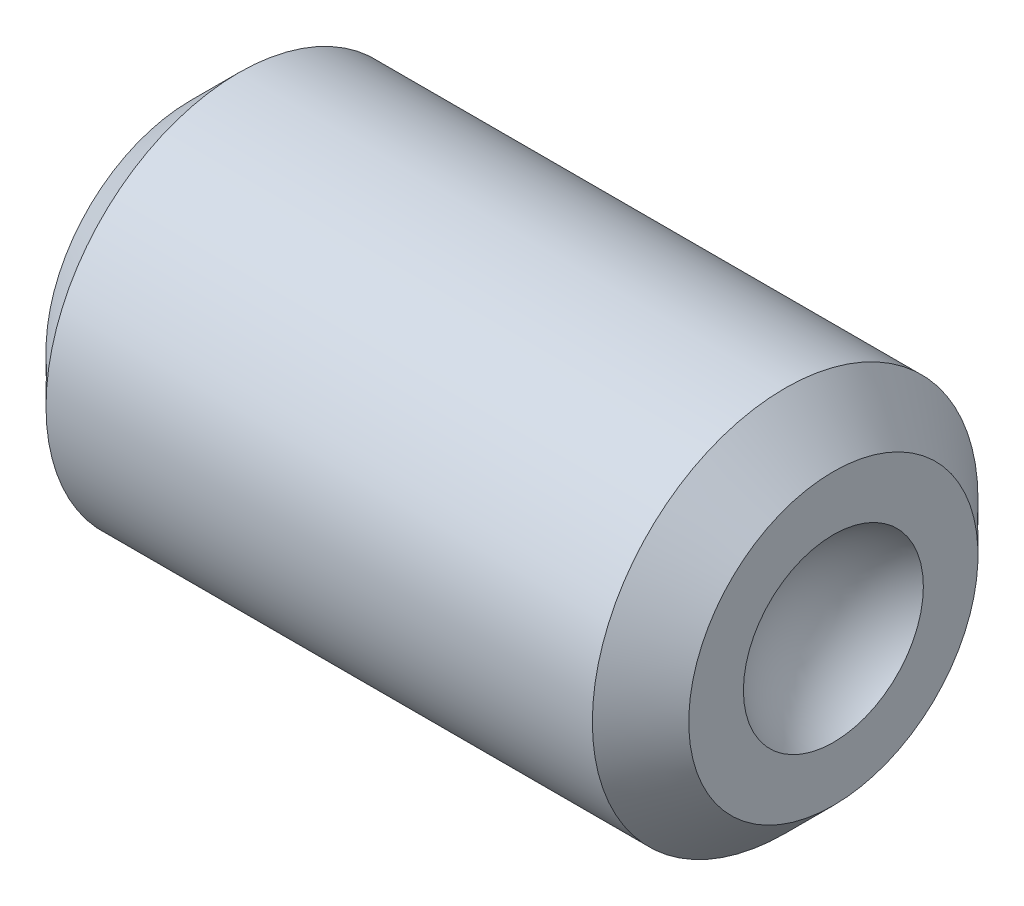
ISO-10303-21;
HEADER;
FILE_DESCRIPTION(('STEP AP214'),'2;1');
FILE_NAME('part.step','',(''),(''),'','','');
FILE_SCHEMA(('AUTOMOTIVE_DESIGN { 1 0 10303 214 1 1 1 1 }'));
ENDSEC;
DATA;
#1=APPLICATION_CONTEXT('core data for automotive mechanical design processes');
#2=APPLICATION_PROTOCOL_DEFINITION('international standard','automotive_design',2000,#1);
#3=PRODUCT_CONTEXT('',#1,'mechanical');
#4=PRODUCT('Part','Part','',(#3));
#5=PRODUCT_RELATED_PRODUCT_CATEGORY('part','',(#4));
#6=PRODUCT_DEFINITION_FORMATION('','',#4);
#7=PRODUCT_DEFINITION_CONTEXT('part definition',#1,'design');
#8=PRODUCT_DEFINITION('design','',#6,#7);
#9=PRODUCT_DEFINITION_SHAPE('','',#8);
#10=(LENGTH_UNIT() NAMED_UNIT(*) SI_UNIT(.MILLI.,.METRE.));
#11=(NAMED_UNIT(*) PLANE_ANGLE_UNIT() SI_UNIT($,.RADIAN.));
#12=(NAMED_UNIT(*) SI_UNIT($,.STERADIAN.) SOLID_ANGLE_UNIT());
#13=UNCERTAINTY_MEASURE_WITH_UNIT(LENGTH_MEASURE(1.E-05),#10,'distance_accuracy_value','');
#14=(GEOMETRIC_REPRESENTATION_CONTEXT(3) GLOBAL_UNCERTAINTY_ASSIGNED_CONTEXT((#13)) GLOBAL_UNIT_ASSIGNED_CONTEXT((#10,
#11,#12)) REPRESENTATION_CONTEXT('',''));
#15=CARTESIAN_POINT('',(0.,0.,0.));
#16=DIRECTION('',(0.,0.,1.));
#17=DIRECTION('',(1.,0.,0.));
#18=AXIS2_PLACEMENT_3D('',#15,#16,#17);
#19=CARTESIAN_POINT('',(0.,0.,0.));
#20=DIRECTION('',(1.,0.,0.));
#21=DIRECTION('',(0.,1.,0.));
#22=AXIS2_PLACEMENT_3D('',#19,#20,#21);
#23=PLANE('',#22);
#24=DIRECTION('',(0.,-0.5,-0.866025403784439));
#25=VECTOR('',#24,1.);
#26=CARTESIAN_POINT('',(0.,0.866025403784439,0.));
#27=LINE('',#26,#25);
#28=CARTESIAN_POINT('',(0.,0.866025403784439,0.));
#29=VERTEX_POINT('',#28);
#30=CARTESIAN_POINT('',(0.,0.43301270189222,-0.75));
#31=VERTEX_POINT('',#30);
#32=EDGE_CURVE('E107',#29,#31,#27,.T.);
#33=ORIENTED_EDGE('',*,*,#32,.F.);
#34=DIRECTION('',(0.,0.5,-0.866025403784439));
#35=VECTOR('',#34,1.);
#36=CARTESIAN_POINT('',(0.,0.433012701892219,0.75));
#37=LINE('',#36,#35);
#38=CARTESIAN_POINT('',(0.,0.433012701892219,0.75));
#39=VERTEX_POINT('',#38);
#40=EDGE_CURVE('E49',#39,#29,#37,.T.);
#41=ORIENTED_EDGE('',*,*,#40,.F.);
#42=DIRECTION('',(0.,1.,0.));
#43=VECTOR('',#42,1.);
#44=CARTESIAN_POINT('',(0.,-0.43301270189222,0.75));
#45=LINE('',#44,#43);
#46=CARTESIAN_POINT('',(0.,-0.43301270189222,0.75));
#47=VERTEX_POINT('',#46);
#48=EDGE_CURVE('E122',#47,#39,#45,.T.);
#49=ORIENTED_EDGE('',*,*,#48,.F.);
#50=DIRECTION('',(0.,0.5,0.866025403784439));
#51=VECTOR('',#50,1.);
#52=CARTESIAN_POINT('',(0.,-0.866025403784439,0.));
#53=LINE('',#52,#51);
#54=CARTESIAN_POINT('',(0.,-0.866025403784439,0.));
#55=VERTEX_POINT('',#54);
#56=EDGE_CURVE('E116',#55,#47,#53,.T.);
#57=ORIENTED_EDGE('',*,*,#56,.F.);
#58=DIRECTION('',(0.,-0.5,0.866025403784439));
#59=VECTOR('',#58,1.);
#60=CARTESIAN_POINT('',(0.,-0.433012701892219,-0.75));
#61=LINE('',#60,#59);
#62=CARTESIAN_POINT('',(0.,-0.433012701892219,-0.75));
#63=VERTEX_POINT('',#62);
#64=EDGE_CURVE('E114',#63,#55,#61,.T.);
#65=ORIENTED_EDGE('',*,*,#64,.F.);
#66=DIRECTION('',(0.,-1.,0.));
#67=VECTOR('',#66,1.);
#68=CARTESIAN_POINT('',(0.,0.43301270189222,-0.75));
#69=LINE('',#68,#67);
#70=EDGE_CURVE('E100',#31,#63,#69,.T.);
#71=ORIENTED_EDGE('',*,*,#70,.F.);
#72=EDGE_LOOP('',(#33,#41,#49,#57,#65,#71));
#73=FACE_BOUND('',#72,.T.);
#74=CARTESIAN_POINT('',(0.,0.,0.));
#75=DIRECTION('',(-1.,0.,0.));
#76=DIRECTION('',(0.,-1.,0.));
#77=AXIS2_PLACEMENT_3D('',#74,#75,#76);
#78=CIRCLE('',#77,1.125);
#79=CARTESIAN_POINT('',(0.,-1.125,0.));
#80=VERTEX_POINT('',#79);
#81=EDGE_CURVE('E12',#80,#80,#78,.T.);
#82=ORIENTED_EDGE('',*,*,#81,.T.);
#83=EDGE_LOOP('',(#82));
#84=FACE_BOUND('',#83,.T.);
#85=ADVANCED_FACE('F35',(#73,#84),#23,.F.);
#86=CARTESIAN_POINT('',(0.375000000000001,0.,0.));
#87=DIRECTION('',(1.,0.,0.));
#88=DIRECTION('',(0.,1.,0.));
#89=AXIS2_PLACEMENT_3D('',#86,#87,#88);
#90=CONICAL_SURFACE('',#89,1.5,0.785398163397447);
#91=ORIENTED_EDGE('',*,*,#81,.F.);
#92=EDGE_LOOP('',(#91));
#93=FACE_BOUND('',#92,.T.);
#94=CARTESIAN_POINT('',(0.375000000000001,0.,0.));
#95=DIRECTION('',(-1.,0.,0.));
#96=DIRECTION('',(0.,-1.,0.));
#97=AXIS2_PLACEMENT_3D('',#94,#95,#96);
#98=CIRCLE('',#97,1.5);
#99=CARTESIAN_POINT('',(0.375000000000001,-1.5,0.));
#100=VERTEX_POINT('',#99);
#101=EDGE_CURVE('E42',#100,#100,#98,.T.);
#102=ORIENTED_EDGE('',*,*,#101,.T.);
#103=EDGE_LOOP('',(#102));
#104=FACE_BOUND('',#103,.T.);
#105=ADVANCED_FACE('F145',(#93,#104),#90,.T.);
#106=CARTESIAN_POINT('',(0.,0.,0.));
#107=DIRECTION('',(-1.,0.,0.));
#108=DIRECTION('',(0.,-1.,0.));
#109=AXIS2_PLACEMENT_3D('',#106,#107,#108);
#110=CYLINDRICAL_SURFACE('',#109,1.5);
#111=ORIENTED_EDGE('',*,*,#101,.F.);
#112=EDGE_LOOP('',(#111));
#113=FACE_BOUND('',#112,.T.);
#114=CARTESIAN_POINT('',(4.625,0.,0.));
#115=DIRECTION('',(-1.,0.,0.));
#116=DIRECTION('',(0.,-1.,0.));
#117=AXIS2_PLACEMENT_3D('',#114,#115,#116);
#118=CIRCLE('',#117,1.5);
#119=CARTESIAN_POINT('',(4.625,-1.5,0.));
#120=VERTEX_POINT('',#119);
#121=EDGE_CURVE('E140',#120,#120,#118,.T.);
#122=ORIENTED_EDGE('',*,*,#121,.T.);
#123=EDGE_LOOP('',(#122));
#124=FACE_BOUND('',#123,.T.);
#125=ADVANCED_FACE('F147',(#113,#124),#110,.T.);
#126=CARTESIAN_POINT('',(5.,0.,0.));
#127=DIRECTION('',(-1.,0.,0.));
#128=DIRECTION('',(0.,-1.,0.));
#129=AXIS2_PLACEMENT_3D('',#126,#127,#128);
#130=CONICAL_SURFACE('',#129,1.125,0.785398163397449);
#131=ORIENTED_EDGE('',*,*,#121,.F.);
#132=EDGE_LOOP('',(#131));
#133=FACE_BOUND('',#132,.T.);
#134=CARTESIAN_POINT('',(5.,0.,0.));
#135=DIRECTION('',(-1.,0.,0.));
#136=DIRECTION('',(0.,-1.,0.));
#137=AXIS2_PLACEMENT_3D('',#134,#135,#136);
#138=CIRCLE('',#137,1.125);
#139=CARTESIAN_POINT('',(5.,-1.125,0.));
#140=VERTEX_POINT('',#139);
#141=EDGE_CURVE('E137',#140,#140,#138,.T.);
#142=ORIENTED_EDGE('',*,*,#141,.T.);
#143=EDGE_LOOP('',(#142));
#144=FACE_BOUND('',#143,.T.);
#145=ADVANCED_FACE('F150',(#133,#144),#130,.T.);
#146=CARTESIAN_POINT('',(5.,1.125,0.));
#147=DIRECTION('',(-1.,0.,0.));
#148=DIRECTION('',(0.,-1.,0.));
#149=AXIS2_PLACEMENT_3D('',#146,#147,#148);
#150=PLANE('',#149);
#151=ORIENTED_EDGE('',*,*,#141,.F.);
#152=EDGE_LOOP('',(#151));
#153=FACE_BOUND('',#152,.T.);
#154=CARTESIAN_POINT('',(5.,0.,0.));
#155=DIRECTION('',(-1.,0.,0.));
#156=DIRECTION('',(0.,-1.,0.));
#157=AXIS2_PLACEMENT_3D('',#154,#155,#156);
#158=CIRCLE('',#157,0.7);
#159=CARTESIAN_POINT('',(5.,-0.7,0.));
#160=VERTEX_POINT('',#159);
#161=EDGE_CURVE('E134',#160,#160,#158,.T.);
#162=ORIENTED_EDGE('',*,*,#161,.T.);
#163=EDGE_LOOP('',(#162));
#164=FACE_BOUND('',#163,.T.);
#165=ADVANCED_FACE('F156',(#153,#164),#150,.F.);
#166=CARTESIAN_POINT('',(5.46583333333333,0.,0.));
#167=DIRECTION('',(-1.,0.,0.));
#168=DIRECTION('',(0.,-1.,0.));
#169=AXIS2_PLACEMENT_3D('',#166,#167,#168);
#170=SPHERICAL_SURFACE('',#169,0.840833333333332);
#171=ORIENTED_EDGE('',*,*,#161,.F.);
#172=EDGE_LOOP('',(#171));
#173=FACE_BOUND('',#172,.T.);
#174=ADVANCED_FACE('F162',(#173),#170,.F.);
#175=CARTESIAN_POINT('',(7.29128784747792,0.433012701892219,0.75));
#176=DIRECTION('',(0.,0.866025403784438,0.5));
#177=DIRECTION('',(0.,-0.5,0.866025403784439));
#178=AXIS2_PLACEMENT_3D('',#175,#176,#177);
#179=PLANE('',#178);
#180=DIRECTION('',(0.,-0.5,0.866025403784439));
#181=VECTOR('',#180,1.);
#182=CARTESIAN_POINT('',(3.,0.433012701892219,0.75));
#183=LINE('',#182,#181);
#184=CARTESIAN_POINT('',(3.,0.866025403784439,0.));
#185=VERTEX_POINT('',#184);
#186=CARTESIAN_POINT('',(3.,0.433012701892219,0.75));
#187=VERTEX_POINT('',#186);
#188=EDGE_CURVE('E68',#185,#187,#183,.T.);
#189=ORIENTED_EDGE('',*,*,#188,.T.);
#190=DIRECTION('',(-1.,0.,0.));
#191=VECTOR('',#190,1.);
#192=CARTESIAN_POINT('',(7.29128784747792,0.433012701892219,0.75));
#193=LINE('',#192,#191);
#194=EDGE_CURVE('E125',#187,#39,#193,.T.);
#195=ORIENTED_EDGE('',*,*,#194,.T.);
#196=ORIENTED_EDGE('',*,*,#40,.T.);
#197=DIRECTION('',(-1.,0.,0.));
#198=VECTOR('',#197,1.);
#199=CARTESIAN_POINT('',(7.29128784747792,0.866025403784439,0.));
#200=LINE('',#199,#198);
#201=EDGE_CURVE('E104',#185,#29,#200,.T.);
#202=ORIENTED_EDGE('',*,*,#201,.F.);
#203=EDGE_LOOP('',(#189,#195,#196,#202));
#204=FACE_BOUND('',#203,.T.);
#205=ADVANCED_FACE('F167',(#204),#179,.F.);
#206=CARTESIAN_POINT('',(7.29128784747792,-0.43301270189222,0.75));
#207=DIRECTION('',(0.,0.,1.));
#208=DIRECTION('',(0.,-1.,0.));
#209=AXIS2_PLACEMENT_3D('',#206,#207,#208);
#210=PLANE('',#209);
#211=DIRECTION('',(0.,-1.,0.));
#212=VECTOR('',#211,1.);
#213=CARTESIAN_POINT('',(3.,-0.43301270189222,0.75));
#214=LINE('',#213,#212);
#215=CARTESIAN_POINT('',(3.,-0.43301270189222,0.75));
#216=VERTEX_POINT('',#215);
#217=EDGE_CURVE('E267',#187,#216,#214,.T.);
#218=ORIENTED_EDGE('',*,*,#217,.T.);
#219=DIRECTION('',(-1.,0.,0.));
#220=VECTOR('',#219,1.);
#221=CARTESIAN_POINT('',(7.29128784747792,-0.43301270189222,0.75));
#222=LINE('',#221,#220);
#223=EDGE_CURVE('E127',#216,#47,#222,.T.);
#224=ORIENTED_EDGE('',*,*,#223,.T.);
#225=ORIENTED_EDGE('',*,*,#48,.T.);
#226=ORIENTED_EDGE('',*,*,#194,.F.);
#227=EDGE_LOOP('',(#218,#224,#225,#226));
#228=FACE_BOUND('',#227,.T.);
#229=ADVANCED_FACE('F172',(#228),#210,.F.);
#230=CARTESIAN_POINT('',(7.29128784747792,-0.866025403784439,0.));
#231=DIRECTION('',(0.,-0.866025403784439,0.5));
#232=DIRECTION('',(0.,-0.5,-0.866025403784439));
#233=AXIS2_PLACEMENT_3D('',#230,#231,#232);
#234=PLANE('',#233);
#235=DIRECTION('',(0.,-0.5,-0.866025403784439));
#236=VECTOR('',#235,1.);
#237=CARTESIAN_POINT('',(3.,-0.866025403784439,0.));
#238=LINE('',#237,#236);
#239=CARTESIAN_POINT('',(3.,-0.866025403784439,0.));
#240=VERTEX_POINT('',#239);
#241=EDGE_CURVE('E270',#216,#240,#238,.T.);
#242=ORIENTED_EDGE('',*,*,#241,.T.);
#243=DIRECTION('',(-1.,0.,0.));
#244=VECTOR('',#243,1.);
#245=CARTESIAN_POINT('',(7.29128784747792,-0.866025403784439,0.));
#246=LINE('',#245,#244);
#247=EDGE_CURVE('E129',#240,#55,#246,.T.);
#248=ORIENTED_EDGE('',*,*,#247,.T.);
#249=ORIENTED_EDGE('',*,*,#56,.T.);
#250=ORIENTED_EDGE('',*,*,#223,.F.);
#251=EDGE_LOOP('',(#242,#248,#249,#250));
#252=FACE_BOUND('',#251,.T.);
#253=ADVANCED_FACE('F217',(#252),#234,.F.);
#254=CARTESIAN_POINT('',(7.29128784747792,-0.433012701892219,-0.75));
#255=DIRECTION('',(0.,-0.866025403784439,-0.5));
#256=DIRECTION('',(0.,0.5,-0.866025403784439));
#257=AXIS2_PLACEMENT_3D('',#254,#255,#256);
#258=PLANE('',#257);
#259=DIRECTION('',(0.,0.5,-0.866025403784439));
#260=VECTOR('',#259,1.);
#261=CARTESIAN_POINT('',(3.,-0.433012701892219,-0.75));
#262=LINE('',#261,#260);
#263=CARTESIAN_POINT('',(3.,-0.433012701892219,-0.75));
#264=VERTEX_POINT('',#263);
#265=EDGE_CURVE('E58',#240,#264,#262,.T.);
#266=ORIENTED_EDGE('',*,*,#265,.T.);
#267=DIRECTION('',(-1.,0.,0.));
#268=VECTOR('',#267,1.);
#269=CARTESIAN_POINT('',(7.29128784747792,-0.433012701892219,-0.75));
#270=LINE('',#269,#268);
#271=EDGE_CURVE('E103',#264,#63,#270,.T.);
#272=ORIENTED_EDGE('',*,*,#271,.T.);
#273=ORIENTED_EDGE('',*,*,#64,.T.);
#274=ORIENTED_EDGE('',*,*,#247,.F.);
#275=EDGE_LOOP('',(#266,#272,#273,#274));
#276=FACE_BOUND('',#275,.T.);
#277=ADVANCED_FACE('F227',(#276),#258,.F.);
#278=CARTESIAN_POINT('',(7.29128784747792,0.43301270189222,-0.75));
#279=DIRECTION('',(0.,0.,-1.));
#280=DIRECTION('',(-1.,0.,0.));
#281=AXIS2_PLACEMENT_3D('',#278,#279,#280);
#282=PLANE('',#281);
#283=DIRECTION('',(0.,1.,0.));
#284=VECTOR('',#283,1.);
#285=CARTESIAN_POINT('',(3.,0.43301270189222,-0.75));
#286=LINE('',#285,#284);
#287=CARTESIAN_POINT('',(3.,0.43301270189222,-0.75));
#288=VERTEX_POINT('',#287);
#289=EDGE_CURVE('E102',#264,#288,#286,.T.);
#290=ORIENTED_EDGE('',*,*,#289,.T.);
#291=DIRECTION('',(-1.,0.,0.));
#292=VECTOR('',#291,1.);
#293=CARTESIAN_POINT('',(7.29128784747792,0.43301270189222,-0.75));
#294=LINE('',#293,#292);
#295=EDGE_CURVE('E95',#288,#31,#294,.T.);
#296=ORIENTED_EDGE('',*,*,#295,.T.);
#297=ORIENTED_EDGE('',*,*,#70,.T.);
#298=ORIENTED_EDGE('',*,*,#271,.F.);
#299=EDGE_LOOP('',(#290,#296,#297,#298));
#300=FACE_BOUND('',#299,.T.);
#301=ADVANCED_FACE('F97',(#300),#282,.F.);
#302=CARTESIAN_POINT('',(7.29128784747792,0.866025403784439,0.));
#303=DIRECTION('',(0.,0.866025403784439,-0.5));
#304=DIRECTION('',(0.,0.5,0.866025403784439));
#305=AXIS2_PLACEMENT_3D('',#302,#303,#304);
#306=PLANE('',#305);
#307=DIRECTION('',(0.,0.5,0.866025403784439));
#308=VECTOR('',#307,1.);
#309=CARTESIAN_POINT('',(3.,0.866025403784439,0.));
#310=LINE('',#309,#308);
#311=EDGE_CURVE('E77',#288,#185,#310,.T.);
#312=ORIENTED_EDGE('',*,*,#311,.T.);
#313=ORIENTED_EDGE('',*,*,#201,.T.);
#314=ORIENTED_EDGE('',*,*,#32,.T.);
#315=ORIENTED_EDGE('',*,*,#295,.F.);
#316=EDGE_LOOP('',(#312,#313,#314,#315));
#317=FACE_BOUND('',#316,.T.);
#318=ADVANCED_FACE('F108',(#317),#306,.F.);
#319=CARTESIAN_POINT('',(3.,1.125,0.));
#320=DIRECTION('',(-1.,0.,0.));
#321=DIRECTION('',(0.,-1.,0.));
#322=AXIS2_PLACEMENT_3D('',#319,#320,#321);
#323=PLANE('',#322);
#324=ORIENTED_EDGE('',*,*,#188,.F.);
#325=ORIENTED_EDGE('',*,*,#311,.F.);
#326=ORIENTED_EDGE('',*,*,#289,.F.);
#327=ORIENTED_EDGE('',*,*,#265,.F.);
#328=ORIENTED_EDGE('',*,*,#241,.F.);
#329=ORIENTED_EDGE('',*,*,#217,.F.);
#330=EDGE_LOOP('',(#324,#325,#326,#327,#328,#329));
#331=FACE_BOUND('',#330,.T.);
#332=ADVANCED_FACE('F253',(#331),#323,.T.);
#333=CLOSED_SHELL('',(#85,#105,#125,#145,#165,#174,#205,#229,#253,#277,#301,#318,#332));
#334=MANIFOLD_SOLID_BREP('B2',#333);
#335=ADVANCED_BREP_SHAPE_REPRESENTATION('',(#18,#334),#14);
#336=SHAPE_DEFINITION_REPRESENTATION(#9,#335);
ENDSEC;
END-ISO-10303-21;
